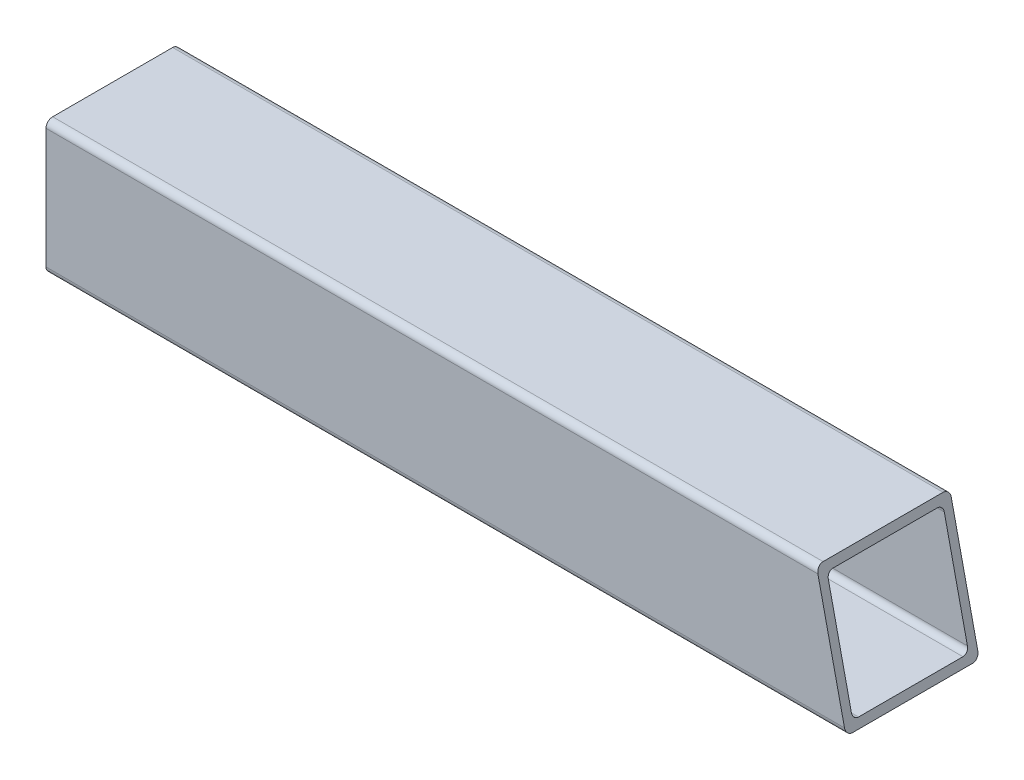
ISO-10303-21;
HEADER;
FILE_DESCRIPTION(('STEP AP214'),'2;1');
FILE_NAME('part.step','',(''),(''),'','','');
FILE_SCHEMA(('AUTOMOTIVE_DESIGN { 1 0 10303 214 1 1 1 1 }'));
ENDSEC;
DATA;
#1=APPLICATION_CONTEXT('core data for automotive mechanical design processes');
#2=APPLICATION_PROTOCOL_DEFINITION('international standard','automotive_design',2000,#1);
#3=PRODUCT_CONTEXT('',#1,'mechanical');
#4=PRODUCT('Part','Part','',(#3));
#5=PRODUCT_RELATED_PRODUCT_CATEGORY('part','',(#4));
#6=PRODUCT_DEFINITION_FORMATION('','',#4);
#7=PRODUCT_DEFINITION_CONTEXT('part definition',#1,'design');
#8=PRODUCT_DEFINITION('design','',#6,#7);
#9=PRODUCT_DEFINITION_SHAPE('','',#8);
#10=(LENGTH_UNIT() NAMED_UNIT(*) SI_UNIT(.MILLI.,.METRE.));
#11=(NAMED_UNIT(*) PLANE_ANGLE_UNIT() SI_UNIT($,.RADIAN.));
#12=(NAMED_UNIT(*) SI_UNIT($,.STERADIAN.) SOLID_ANGLE_UNIT());
#13=UNCERTAINTY_MEASURE_WITH_UNIT(LENGTH_MEASURE(1.E-05),#10,'distance_accuracy_value','');
#14=(GEOMETRIC_REPRESENTATION_CONTEXT(3) GLOBAL_UNCERTAINTY_ASSIGNED_CONTEXT((#13)) GLOBAL_UNIT_ASSIGNED_CONTEXT((#10,
#11,#12)) REPRESENTATION_CONTEXT('',''));
#15=CARTESIAN_POINT('',(0.,0.,0.));
#16=DIRECTION('',(0.,0.,1.));
#17=DIRECTION('',(1.,0.,0.));
#18=AXIS2_PLACEMENT_3D('',#15,#16,#17);
#19=CARTESIAN_POINT('',(76.2,-11.43,-11.43));
#20=DIRECTION('',(-1.,0.,0.));
#21=DIRECTION('',(0.,0.,1.));
#22=AXIS2_PLACEMENT_3D('',#19,#20,#21);
#23=CYLINDRICAL_SURFACE('',#22,1.27);
#24=DIRECTION('',(-1.,0.,0.));
#25=VECTOR('',#24,1.);
#26=CARTESIAN_POINT('',(76.2,-11.43,-12.7));
#27=LINE('',#26,#25);
#28=CARTESIAN_POINT('',(75.9184477784435,-11.43,-12.7));
#29=VERTEX_POINT('',#28);
#30=CARTESIAN_POINT('',(-76.2,-11.43,-12.7));
#31=VERTEX_POINT('',#30);
#32=EDGE_CURVE('E48',#29,#31,#27,.T.);
#33=ORIENTED_EDGE('',*,*,#32,.F.);
#34=CARTESIAN_POINT('',(75.9184477784435,-11.43,-11.43));
#35=DIRECTION('',(-0.976296007119935,-0.216439613938097,0.));
#36=DIRECTION('',(-0.216439613938097,0.976296007119935,0.));
#37=AXIS2_PLACEMENT_3D('',#34,#35,#36);
#38=ELLIPSE('',#37,1.30083498317943,1.27);
#39=CARTESIAN_POINT('',(76.2,-12.7,-11.43));
#40=VERTEX_POINT('',#39);
#41=EDGE_CURVE('E257',#29,#40,#38,.T.);
#42=ORIENTED_EDGE('',*,*,#41,.T.);
#43=DIRECTION('',(-1.,0.,0.));
#44=VECTOR('',#43,1.);
#45=CARTESIAN_POINT('',(76.2,-12.7,-11.43));
#46=LINE('',#45,#44);
#47=CARTESIAN_POINT('',(-76.2,-12.7,-11.43));
#48=VERTEX_POINT('',#47);
#49=EDGE_CURVE('E207',#40,#48,#46,.T.);
#50=ORIENTED_EDGE('',*,*,#49,.T.);
#51=CARTESIAN_POINT('',(-76.2,-11.43,-11.43));
#52=DIRECTION('',(1.,0.,0.));
#53=DIRECTION('',(0.,0.,-1.));
#54=AXIS2_PLACEMENT_3D('',#51,#52,#53);
#55=CIRCLE('',#54,1.27);
#56=EDGE_CURVE('E200',#48,#31,#55,.T.);
#57=ORIENTED_EDGE('',*,*,#56,.T.);
#58=EDGE_LOOP('',(#33,#42,#50,#57));
#59=FACE_BOUND('',#58,.T.);
#60=ADVANCED_FACE('F41',(#59),#23,.T.);
#61=CARTESIAN_POINT('',(76.2,-11.43,-12.7));
#62=DIRECTION('',(0.,0.,1.));
#63=DIRECTION('',(1.,0.,0.));
#64=AXIS2_PLACEMENT_3D('',#61,#62,#63);
#65=PLANE('',#64);
#66=DIRECTION('',(-1.,0.,0.));
#67=VECTOR('',#66,1.);
#68=CARTESIAN_POINT('',(76.2,11.43,-12.7));
#69=LINE('',#68,#67);
#70=CARTESIAN_POINT('',(70.850507790426,11.43,-12.7));
#71=VERTEX_POINT('',#70);
#72=CARTESIAN_POINT('',(-76.2,11.43,-12.7));
#73=VERTEX_POINT('',#72);
#74=EDGE_CURVE('E183',#71,#73,#69,.T.);
#75=ORIENTED_EDGE('',*,*,#74,.F.);
#76=DIRECTION('',(0.216439613938097,-0.976296007119935,0.));
#77=VECTOR('',#76,1.);
#78=CARTESIAN_POINT('',(76.2,-12.7,-12.7));
#79=LINE('',#78,#77);
#80=EDGE_CURVE('E168',#71,#29,#79,.T.);
#81=ORIENTED_EDGE('',*,*,#80,.T.);
#82=ORIENTED_EDGE('',*,*,#32,.T.);
#83=DIRECTION('',(0.,1.,0.));
#84=VECTOR('',#83,1.);
#85=CARTESIAN_POINT('',(-76.2,-11.43,-12.7));
#86=LINE('',#85,#84);
#87=EDGE_CURVE('E191',#31,#73,#86,.T.);
#88=ORIENTED_EDGE('',*,*,#87,.T.);
#89=EDGE_LOOP('',(#75,#81,#82,#88));
#90=FACE_BOUND('',#89,.T.);
#91=ADVANCED_FACE('F190',(#90),#65,.F.);
#92=CARTESIAN_POINT('',(76.2,11.43,-11.43));
#93=DIRECTION('',(-1.,0.,0.));
#94=DIRECTION('',(0.,0.,1.));
#95=AXIS2_PLACEMENT_3D('',#92,#93,#94);
#96=CYLINDRICAL_SURFACE('',#95,1.27);
#97=DIRECTION('',(-1.,0.,0.));
#98=VECTOR('',#97,1.);
#99=CARTESIAN_POINT('',(76.2,12.7,-11.43));
#100=LINE('',#99,#98);
#101=CARTESIAN_POINT('',(70.5689555688695,12.7,-11.43));
#102=VERTEX_POINT('',#101);
#103=CARTESIAN_POINT('',(-76.2,12.7,-11.43));
#104=VERTEX_POINT('',#103);
#105=EDGE_CURVE('E176',#102,#104,#100,.T.);
#106=ORIENTED_EDGE('',*,*,#105,.F.);
#107=CARTESIAN_POINT('',(70.850507790426,11.43,-11.43));
#108=DIRECTION('',(-0.976296007119935,-0.216439613938097,0.));
#109=DIRECTION('',(-0.216439613938097,0.976296007119935,0.));
#110=AXIS2_PLACEMENT_3D('',#107,#108,#109);
#111=ELLIPSE('',#110,1.30083498317942,1.27);
#112=EDGE_CURVE('E159',#102,#71,#111,.T.);
#113=ORIENTED_EDGE('',*,*,#112,.T.);
#114=ORIENTED_EDGE('',*,*,#74,.T.);
#115=CARTESIAN_POINT('',(-76.2,11.43,-11.43));
#116=DIRECTION('',(1.,0.,0.));
#117=DIRECTION('',(0.,0.,-1.));
#118=AXIS2_PLACEMENT_3D('',#115,#116,#117);
#119=CIRCLE('',#118,1.27);
#120=EDGE_CURVE('E204',#73,#104,#119,.T.);
#121=ORIENTED_EDGE('',*,*,#120,.T.);
#122=EDGE_LOOP('',(#106,#113,#114,#121));
#123=FACE_BOUND('',#122,.T.);
#124=ADVANCED_FACE('F256',(#123),#96,.T.);
#125=CARTESIAN_POINT('',(76.2,12.7,-11.43));
#126=DIRECTION('',(0.,-1.,0.));
#127=DIRECTION('',(0.,0.,-1.));
#128=AXIS2_PLACEMENT_3D('',#125,#126,#127);
#129=PLANE('',#128);
#130=DIRECTION('',(-1.,0.,0.));
#131=VECTOR('',#130,1.);
#132=CARTESIAN_POINT('',(76.2,12.7,11.43));
#133=LINE('',#132,#131);
#134=CARTESIAN_POINT('',(70.5689555688695,12.7,11.43));
#135=VERTEX_POINT('',#134);
#136=CARTESIAN_POINT('',(-76.2,12.7,11.43));
#137=VERTEX_POINT('',#136);
#138=EDGE_CURVE('E174',#135,#137,#133,.T.);
#139=ORIENTED_EDGE('',*,*,#138,.F.);
#140=DIRECTION('',(0.,0.,1.));
#141=VECTOR('',#140,1.);
#142=CARTESIAN_POINT('',(70.5689555688695,12.7,-12.7));
#143=LINE('',#142,#141);
#144=EDGE_CURVE('E155',#102,#135,#143,.T.);
#145=ORIENTED_EDGE('',*,*,#144,.F.);
#146=ORIENTED_EDGE('',*,*,#105,.T.);
#147=DIRECTION('',(0.,0.,1.));
#148=VECTOR('',#147,1.);
#149=CARTESIAN_POINT('',(-76.2,12.7,-11.43));
#150=LINE('',#149,#148);
#151=EDGE_CURVE('E216',#104,#137,#150,.T.);
#152=ORIENTED_EDGE('',*,*,#151,.T.);
#153=EDGE_LOOP('',(#139,#145,#146,#152));
#154=FACE_BOUND('',#153,.T.);
#155=ADVANCED_FACE('F252',(#154),#129,.F.);
#156=CARTESIAN_POINT('',(76.2,11.43,11.43));
#157=DIRECTION('',(-1.,0.,0.));
#158=DIRECTION('',(0.,0.,1.));
#159=AXIS2_PLACEMENT_3D('',#156,#157,#158);
#160=CYLINDRICAL_SURFACE('',#159,1.27);
#161=DIRECTION('',(-1.,0.,0.));
#162=VECTOR('',#161,1.);
#163=CARTESIAN_POINT('',(76.2,11.43,12.7));
#164=LINE('',#163,#162);
#165=CARTESIAN_POINT('',(70.850507790426,11.43,12.7));
#166=VERTEX_POINT('',#165);
#167=CARTESIAN_POINT('',(-76.2,11.43,12.7));
#168=VERTEX_POINT('',#167);
#169=EDGE_CURVE('E165',#166,#168,#164,.T.);
#170=ORIENTED_EDGE('',*,*,#169,.F.);
#171=CARTESIAN_POINT('',(70.850507790426,11.43,11.43));
#172=DIRECTION('',(-0.976296007119935,-0.216439613938097,0.));
#173=DIRECTION('',(-0.216439613938097,0.976296007119935,0.));
#174=AXIS2_PLACEMENT_3D('',#171,#172,#173);
#175=ELLIPSE('',#174,1.30083498317943,1.27);
#176=EDGE_CURVE('E150',#166,#135,#175,.T.);
#177=ORIENTED_EDGE('',*,*,#176,.T.);
#178=ORIENTED_EDGE('',*,*,#138,.T.);
#179=CARTESIAN_POINT('',(-76.2,11.43,11.43));
#180=DIRECTION('',(1.,0.,0.));
#181=DIRECTION('',(0.,0.,-1.));
#182=AXIS2_PLACEMENT_3D('',#179,#180,#181);
#183=CIRCLE('',#182,1.27);
#184=EDGE_CURVE('E173',#137,#168,#183,.T.);
#185=ORIENTED_EDGE('',*,*,#184,.T.);
#186=EDGE_LOOP('',(#170,#177,#178,#185));
#187=FACE_BOUND('',#186,.T.);
#188=ADVANCED_FACE('F171',(#187),#160,.T.);
#189=CARTESIAN_POINT('',(76.2,-11.43,12.7));
#190=DIRECTION('',(0.,0.,-1.));
#191=DIRECTION('',(-1.,0.,0.));
#192=AXIS2_PLACEMENT_3D('',#189,#190,#191);
#193=PLANE('',#192);
#194=DIRECTION('',(-1.,0.,0.));
#195=VECTOR('',#194,1.);
#196=CARTESIAN_POINT('',(76.2,-11.43,12.7));
#197=LINE('',#196,#195);
#198=CARTESIAN_POINT('',(75.9184477784435,-11.43,12.7));
#199=VERTEX_POINT('',#198);
#200=CARTESIAN_POINT('',(-76.2,-11.43,12.7));
#201=VERTEX_POINT('',#200);
#202=EDGE_CURVE('E167',#199,#201,#197,.T.);
#203=ORIENTED_EDGE('',*,*,#202,.F.);
#204=DIRECTION('',(0.216439613938097,-0.976296007119935,0.));
#205=VECTOR('',#204,1.);
#206=CARTESIAN_POINT('',(76.2,-12.7,12.7));
#207=LINE('',#206,#205);
#208=EDGE_CURVE('E153',#166,#199,#207,.T.);
#209=ORIENTED_EDGE('',*,*,#208,.F.);
#210=ORIENTED_EDGE('',*,*,#169,.T.);
#211=DIRECTION('',(0.,-1.,0.));
#212=VECTOR('',#211,1.);
#213=CARTESIAN_POINT('',(-76.2,-11.43,12.7));
#214=LINE('',#213,#212);
#215=EDGE_CURVE('E220',#168,#201,#214,.T.);
#216=ORIENTED_EDGE('',*,*,#215,.T.);
#217=EDGE_LOOP('',(#203,#209,#210,#216));
#218=FACE_BOUND('',#217,.T.);
#219=ADVANCED_FACE('F163',(#218),#193,.F.);
#220=CARTESIAN_POINT('',(76.2,-11.43,11.43));
#221=DIRECTION('',(-1.,0.,0.));
#222=DIRECTION('',(0.,0.,1.));
#223=AXIS2_PLACEMENT_3D('',#220,#221,#222);
#224=CYLINDRICAL_SURFACE('',#223,1.27);
#225=DIRECTION('',(-1.,0.,0.));
#226=VECTOR('',#225,1.);
#227=CARTESIAN_POINT('',(76.2,-12.7,11.43));
#228=LINE('',#227,#226);
#229=CARTESIAN_POINT('',(76.2,-12.7,11.43));
#230=VERTEX_POINT('',#229);
#231=CARTESIAN_POINT('',(-76.2,-12.7,11.43));
#232=VERTEX_POINT('',#231);
#233=EDGE_CURVE('E178',#230,#232,#228,.T.);
#234=ORIENTED_EDGE('',*,*,#233,.F.);
#235=CARTESIAN_POINT('',(75.9184477784435,-11.43,11.43));
#236=DIRECTION('',(-0.976296007119935,-0.216439613938097,0.));
#237=DIRECTION('',(-0.216439613938097,0.976296007119935,0.));
#238=AXIS2_PLACEMENT_3D('',#235,#236,#237);
#239=ELLIPSE('',#238,1.30083498317943,1.27);
#240=EDGE_CURVE('E62',#230,#199,#239,.T.);
#241=ORIENTED_EDGE('',*,*,#240,.T.);
#242=ORIENTED_EDGE('',*,*,#202,.T.);
#243=CARTESIAN_POINT('',(-76.2,-11.43,11.43));
#244=DIRECTION('',(1.,0.,0.));
#245=DIRECTION('',(0.,0.,-1.));
#246=AXIS2_PLACEMENT_3D('',#243,#244,#245);
#247=CIRCLE('',#246,1.27);
#248=EDGE_CURVE('E222',#201,#232,#247,.T.);
#249=ORIENTED_EDGE('',*,*,#248,.T.);
#250=EDGE_LOOP('',(#234,#241,#242,#249));
#251=FACE_BOUND('',#250,.T.);
#252=ADVANCED_FACE('F250',(#251),#224,.T.);
#253=CARTESIAN_POINT('',(76.2,-12.7,-11.43));
#254=DIRECTION('',(0.,1.,0.));
#255=DIRECTION('',(0.,0.,1.));
#256=AXIS2_PLACEMENT_3D('',#253,#254,#255);
#257=PLANE('',#256);
#258=ORIENTED_EDGE('',*,*,#233,.T.);
#259=DIRECTION('',(0.,0.,-1.));
#260=VECTOR('',#259,1.);
#261=CARTESIAN_POINT('',(-76.2,-12.7,-11.43));
#262=LINE('',#261,#260);
#263=EDGE_CURVE('E225',#232,#48,#262,.T.);
#264=ORIENTED_EDGE('',*,*,#263,.T.);
#265=ORIENTED_EDGE('',*,*,#49,.F.);
#266=DIRECTION('',(0.,0.,-1.));
#267=VECTOR('',#266,1.);
#268=CARTESIAN_POINT('',(76.2,-12.7,-11.43));
#269=LINE('',#268,#267);
#270=EDGE_CURVE('E243',#230,#40,#269,.T.);
#271=ORIENTED_EDGE('',*,*,#270,.F.);
#272=EDGE_LOOP('',(#258,#264,#265,#271));
#273=FACE_BOUND('',#272,.T.);
#274=ADVANCED_FACE('F247',(#273),#257,.F.);
#275=CARTESIAN_POINT('',(76.2,9.9441,-9.9441));
#276=DIRECTION('',(-1.,0.,0.));
#277=DIRECTION('',(0.,0.,1.));
#278=AXIS2_PLACEMENT_3D('',#275,#276,#277);
#279=CYLINDRICAL_SURFACE('',#278,1.1049);
#280=CARTESIAN_POINT('',(71.1799238896472,9.9441,-9.9441));
#281=DIRECTION('',(-0.976296007119935,-0.216439613938097,0.));
#282=DIRECTION('',(-0.216439613938097,0.976296007119935,0.));
#283=AXIS2_PLACEMENT_3D('',#280,#281,#282);
#284=ELLIPSE('',#283,1.1317264353661,1.1049);
#285=CARTESIAN_POINT('',(70.934973456893,11.049,-9.94409999999999));
#286=VERTEX_POINT('',#285);
#287=CARTESIAN_POINT('',(71.1799238896472,9.9441,-11.049));
#288=VERTEX_POINT('',#287);
#289=EDGE_CURVE('E54',#286,#288,#284,.T.);
#290=ORIENTED_EDGE('',*,*,#289,.F.);
#291=DIRECTION('',(-1.,0.,0.));
#292=VECTOR('',#291,1.);
#293=CARTESIAN_POINT('',(76.2,11.049,-9.94409999999999));
#294=LINE('',#293,#292);
#295=CARTESIAN_POINT('',(-76.2,11.049,-9.94409999999999));
#296=VERTEX_POINT('',#295);
#297=EDGE_CURVE('E241',#286,#296,#294,.T.);
#298=ORIENTED_EDGE('',*,*,#297,.T.);
#299=CARTESIAN_POINT('',(-76.2,9.9441,-9.9441));
#300=DIRECTION('',(1.,0.,0.));
#301=DIRECTION('',(0.,0.,-1.));
#302=AXIS2_PLACEMENT_3D('',#299,#300,#301);
#303=CIRCLE('',#302,1.1049);
#304=CARTESIAN_POINT('',(-76.2,9.9441,-11.049));
#305=VERTEX_POINT('',#304);
#306=EDGE_CURVE('E259',#305,#296,#303,.T.);
#307=ORIENTED_EDGE('',*,*,#306,.F.);
#308=DIRECTION('',(-1.,0.,0.));
#309=VECTOR('',#308,1.);
#310=CARTESIAN_POINT('',(76.2,9.9441,-11.049));
#311=LINE('',#310,#309);
#312=EDGE_CURVE('E227',#288,#305,#311,.T.);
#313=ORIENTED_EDGE('',*,*,#312,.F.);
#314=EDGE_LOOP('',(#290,#298,#307,#313));
#315=FACE_BOUND('',#314,.T.);
#316=ADVANCED_FACE('F295',(#315),#279,.F.);
#317=CARTESIAN_POINT('',(76.2,11.049,-9.94409999999999));
#318=DIRECTION('',(0.,-1.,0.));
#319=DIRECTION('',(0.,0.,-1.));
#320=AXIS2_PLACEMENT_3D('',#317,#318,#319);
#321=PLANE('',#320);
#322=DIRECTION('',(0.,0.,-1.));
#323=VECTOR('',#322,1.);
#324=CARTESIAN_POINT('',(70.934973456893,11.049,-9.94409999999999));
#325=LINE('',#324,#323);
#326=CARTESIAN_POINT('',(70.934973456893,11.049,9.94409999999999));
#327=VERTEX_POINT('',#326);
#328=EDGE_CURVE('E303',#327,#286,#325,.T.);
#329=ORIENTED_EDGE('',*,*,#328,.F.);
#330=DIRECTION('',(-1.,0.,0.));
#331=VECTOR('',#330,1.);
#332=CARTESIAN_POINT('',(76.2,11.049,9.94409999999999));
#333=LINE('',#332,#331);
#334=CARTESIAN_POINT('',(-76.2,11.049,9.94409999999999));
#335=VERTEX_POINT('',#334);
#336=EDGE_CURVE('E239',#327,#335,#333,.T.);
#337=ORIENTED_EDGE('',*,*,#336,.T.);
#338=DIRECTION('',(0.,0.,1.));
#339=VECTOR('',#338,1.);
#340=CARTESIAN_POINT('',(-76.2,11.049,-9.94409999999999));
#341=LINE('',#340,#339);
#342=EDGE_CURVE('E265',#296,#335,#341,.T.);
#343=ORIENTED_EDGE('',*,*,#342,.F.);
#344=ORIENTED_EDGE('',*,*,#297,.F.);
#345=EDGE_LOOP('',(#329,#337,#343,#344));
#346=FACE_BOUND('',#345,.T.);
#347=ADVANCED_FACE('F301',(#346),#321,.T.);
#348=CARTESIAN_POINT('',(76.2,9.94409999999999,9.94409999999999));
#349=DIRECTION('',(-1.,0.,0.));
#350=DIRECTION('',(0.,0.,1.));
#351=AXIS2_PLACEMENT_3D('',#348,#349,#350);
#352=CYLINDRICAL_SURFACE('',#351,1.10490000000001);
#353=CARTESIAN_POINT('',(71.1799238896472,9.94409999999999,9.94409999999999));
#354=DIRECTION('',(-0.976296007119935,-0.216439613938097,0.));
#355=DIRECTION('',(-0.216439613938097,0.976296007119935,0.));
#356=AXIS2_PLACEMENT_3D('',#353,#354,#355);
#357=ELLIPSE('',#356,1.13172643536611,1.10490000000001);
#358=CARTESIAN_POINT('',(71.1799238896472,9.94409999999999,11.049));
#359=VERTEX_POINT('',#358);
#360=EDGE_CURVE('E309',#359,#327,#357,.T.);
#361=ORIENTED_EDGE('',*,*,#360,.F.);
#362=DIRECTION('',(-1.,0.,0.));
#363=VECTOR('',#362,1.);
#364=CARTESIAN_POINT('',(76.2,9.94409999999999,11.049));
#365=LINE('',#364,#363);
#366=CARTESIAN_POINT('',(-76.2,9.94409999999999,11.049));
#367=VERTEX_POINT('',#366);
#368=EDGE_CURVE('E237',#359,#367,#365,.T.);
#369=ORIENTED_EDGE('',*,*,#368,.T.);
#370=CARTESIAN_POINT('',(-76.2,9.94409999999999,9.94409999999999));
#371=DIRECTION('',(1.,0.,0.));
#372=DIRECTION('',(0.,0.,-1.));
#373=AXIS2_PLACEMENT_3D('',#370,#371,#372);
#374=CIRCLE('',#373,1.10490000000001);
#375=EDGE_CURVE('E268',#335,#367,#374,.T.);
#376=ORIENTED_EDGE('',*,*,#375,.F.);
#377=ORIENTED_EDGE('',*,*,#336,.F.);
#378=EDGE_LOOP('',(#361,#369,#376,#377));
#379=FACE_BOUND('',#378,.T.);
#380=ADVANCED_FACE('F306',(#379),#352,.F.);
#381=CARTESIAN_POINT('',(76.2,9.94409999999999,11.049));
#382=DIRECTION('',(0.,0.,-1.));
#383=DIRECTION('',(0.,1.,0.));
#384=AXIS2_PLACEMENT_3D('',#381,#382,#383);
#385=PLANE('',#384);
#386=DIRECTION('',(-0.216439613938097,0.976296007119935,0.));
#387=VECTOR('',#386,1.);
#388=CARTESIAN_POINT('',(71.4150949096588,8.88331208021836,11.049));
#389=LINE('',#388,#387);
#390=CARTESIAN_POINT('',(75.5890316792223,-9.9441,11.049));
#391=VERTEX_POINT('',#390);
#392=EDGE_CURVE('E325',#391,#359,#389,.T.);
#393=ORIENTED_EDGE('',*,*,#392,.F.);
#394=DIRECTION('',(-1.,0.,0.));
#395=VECTOR('',#394,1.);
#396=CARTESIAN_POINT('',(76.2,-9.9441,11.049));
#397=LINE('',#396,#395);
#398=CARTESIAN_POINT('',(-76.2,-9.9441,11.049));
#399=VERTEX_POINT('',#398);
#400=EDGE_CURVE('E235',#391,#399,#397,.T.);
#401=ORIENTED_EDGE('',*,*,#400,.T.);
#402=DIRECTION('',(0.,-1.,0.));
#403=VECTOR('',#402,1.);
#404=CARTESIAN_POINT('',(-76.2,9.94409999999999,11.049));
#405=LINE('',#404,#403);
#406=EDGE_CURVE('E271',#367,#399,#405,.T.);
#407=ORIENTED_EDGE('',*,*,#406,.F.);
#408=ORIENTED_EDGE('',*,*,#368,.F.);
#409=EDGE_LOOP('',(#393,#401,#407,#408));
#410=FACE_BOUND('',#409,.T.);
#411=ADVANCED_FACE('F312',(#410),#385,.T.);
#412=CARTESIAN_POINT('',(76.2,-9.9441,9.9441));
#413=DIRECTION('',(-1.,0.,0.));
#414=DIRECTION('',(0.,0.,1.));
#415=AXIS2_PLACEMENT_3D('',#412,#413,#414);
#416=CYLINDRICAL_SURFACE('',#415,1.1049);
#417=CARTESIAN_POINT('',(75.5890316792223,-9.9441,9.9441));
#418=DIRECTION('',(-0.976296007119935,-0.216439613938097,0.));
#419=DIRECTION('',(-0.216439613938097,0.976296007119935,0.));
#420=AXIS2_PLACEMENT_3D('',#417,#418,#419);
#421=ELLIPSE('',#420,1.1317264353661,1.1049);
#422=CARTESIAN_POINT('',(75.8339821119765,-11.049,9.94409999999999));
#423=VERTEX_POINT('',#422);
#424=EDGE_CURVE('E319',#423,#391,#421,.T.);
#425=ORIENTED_EDGE('',*,*,#424,.F.);
#426=DIRECTION('',(-1.,0.,0.));
#427=VECTOR('',#426,1.);
#428=CARTESIAN_POINT('',(76.2,-11.049,9.94409999999999));
#429=LINE('',#428,#427);
#430=CARTESIAN_POINT('',(-76.2,-11.049,9.94409999999999));
#431=VERTEX_POINT('',#430);
#432=EDGE_CURVE('E233',#423,#431,#429,.T.);
#433=ORIENTED_EDGE('',*,*,#432,.T.);
#434=CARTESIAN_POINT('',(-76.2,-9.9441,9.9441));
#435=DIRECTION('',(1.,0.,0.));
#436=DIRECTION('',(0.,0.,-1.));
#437=AXIS2_PLACEMENT_3D('',#434,#435,#436);
#438=CIRCLE('',#437,1.1049);
#439=EDGE_CURVE('E274',#399,#431,#438,.T.);
#440=ORIENTED_EDGE('',*,*,#439,.F.);
#441=ORIENTED_EDGE('',*,*,#400,.F.);
#442=EDGE_LOOP('',(#425,#433,#440,#441));
#443=FACE_BOUND('',#442,.T.);
#444=ADVANCED_FACE('F317',(#443),#416,.F.);
#445=CARTESIAN_POINT('',(76.2,-11.049,-9.94409999999999));
#446=DIRECTION('',(0.,1.,0.));
#447=DIRECTION('',(0.,0.,1.));
#448=AXIS2_PLACEMENT_3D('',#445,#446,#447);
#449=PLANE('',#448);
#450=DIRECTION('',(0.,0.,1.));
#451=VECTOR('',#450,1.);
#452=CARTESIAN_POINT('',(75.8339821119765,-11.049,-9.94409999999999));
#453=LINE('',#452,#451);
#454=CARTESIAN_POINT('',(75.8339821119765,-11.049,-9.94409999999999));
#455=VERTEX_POINT('',#454);
#456=EDGE_CURVE('E323',#455,#423,#453,.T.);
#457=ORIENTED_EDGE('',*,*,#456,.F.);
#458=DIRECTION('',(-1.,0.,0.));
#459=VECTOR('',#458,1.);
#460=CARTESIAN_POINT('',(76.2,-11.049,-9.94409999999999));
#461=LINE('',#460,#459);
#462=CARTESIAN_POINT('',(-76.2,-11.049,-9.94409999999999));
#463=VERTEX_POINT('',#462);
#464=EDGE_CURVE('E231',#455,#463,#461,.T.);
#465=ORIENTED_EDGE('',*,*,#464,.T.);
#466=DIRECTION('',(0.,0.,-1.));
#467=VECTOR('',#466,1.);
#468=CARTESIAN_POINT('',(-76.2,-11.049,-9.94409999999999));
#469=LINE('',#468,#467);
#470=EDGE_CURVE('E277',#431,#463,#469,.T.);
#471=ORIENTED_EDGE('',*,*,#470,.F.);
#472=ORIENTED_EDGE('',*,*,#432,.F.);
#473=EDGE_LOOP('',(#457,#465,#471,#472));
#474=FACE_BOUND('',#473,.T.);
#475=ADVANCED_FACE('F322',(#474),#449,.T.);
#476=CARTESIAN_POINT('',(76.2,-9.9441,-9.9441));
#477=DIRECTION('',(-1.,0.,0.));
#478=DIRECTION('',(0.,0.,1.));
#479=AXIS2_PLACEMENT_3D('',#476,#477,#478);
#480=CYLINDRICAL_SURFACE('',#479,1.1049);
#481=CARTESIAN_POINT('',(75.5890316792223,-9.9441,-9.9441));
#482=DIRECTION('',(-0.976296007119935,-0.216439613938097,0.));
#483=DIRECTION('',(-0.216439613938097,0.976296007119935,0.));
#484=AXIS2_PLACEMENT_3D('',#481,#482,#483);
#485=ELLIPSE('',#484,1.1317264353661,1.1049);
#486=CARTESIAN_POINT('',(75.5890316792223,-9.9441,-11.049));
#487=VERTEX_POINT('',#486);
#488=EDGE_CURVE('E289',#487,#455,#485,.T.);
#489=ORIENTED_EDGE('',*,*,#488,.F.);
#490=DIRECTION('',(-1.,0.,0.));
#491=VECTOR('',#490,1.);
#492=CARTESIAN_POINT('',(76.2,-9.9441,-11.049));
#493=LINE('',#492,#491);
#494=CARTESIAN_POINT('',(-76.2,-9.9441,-11.049));
#495=VERTEX_POINT('',#494);
#496=EDGE_CURVE('E229',#487,#495,#493,.T.);
#497=ORIENTED_EDGE('',*,*,#496,.T.);
#498=CARTESIAN_POINT('',(-76.2,-9.9441,-9.9441));
#499=DIRECTION('',(1.,0.,0.));
#500=DIRECTION('',(0.,0.,-1.));
#501=AXIS2_PLACEMENT_3D('',#498,#499,#500);
#502=CIRCLE('',#501,1.1049);
#503=EDGE_CURVE('E211',#463,#495,#502,.T.);
#504=ORIENTED_EDGE('',*,*,#503,.F.);
#505=ORIENTED_EDGE('',*,*,#464,.F.);
#506=EDGE_LOOP('',(#489,#497,#504,#505));
#507=FACE_BOUND('',#506,.T.);
#508=ADVANCED_FACE('F287',(#507),#480,.F.);
#509=CARTESIAN_POINT('',(76.2,9.9441,-11.049));
#510=DIRECTION('',(0.,0.,1.));
#511=DIRECTION('',(1.,0.,0.));
#512=AXIS2_PLACEMENT_3D('',#509,#510,#511);
#513=PLANE('',#512);
#514=DIRECTION('',(0.216439613938097,-0.976296007119935,0.));
#515=VECTOR('',#514,1.);
#516=CARTESIAN_POINT('',(71.4150949096588,8.88331208021836,-11.049));
#517=LINE('',#516,#515);
#518=EDGE_CURVE('E11',#288,#487,#517,.T.);
#519=ORIENTED_EDGE('',*,*,#518,.F.);
#520=ORIENTED_EDGE('',*,*,#312,.T.);
#521=DIRECTION('',(0.,1.,0.));
#522=VECTOR('',#521,1.);
#523=CARTESIAN_POINT('',(-76.2,9.9441,-11.049));
#524=LINE('',#523,#522);
#525=EDGE_CURVE('E208',#495,#305,#524,.T.);
#526=ORIENTED_EDGE('',*,*,#525,.F.);
#527=ORIENTED_EDGE('',*,*,#496,.F.);
#528=EDGE_LOOP('',(#519,#520,#526,#527));
#529=FACE_BOUND('',#528,.T.);
#530=ADVANCED_FACE('F291',(#529),#513,.T.);
#531=CARTESIAN_POINT('',(-76.2,-11.43,-11.43));
#532=DIRECTION('',(1.,0.,0.));
#533=DIRECTION('',(0.,0.,-1.));
#534=AXIS2_PLACEMENT_3D('',#531,#532,#533);
#535=PLANE('',#534);
#536=ORIENTED_EDGE('',*,*,#525,.T.);
#537=ORIENTED_EDGE('',*,*,#306,.T.);
#538=ORIENTED_EDGE('',*,*,#342,.T.);
#539=ORIENTED_EDGE('',*,*,#375,.T.);
#540=ORIENTED_EDGE('',*,*,#406,.T.);
#541=ORIENTED_EDGE('',*,*,#439,.T.);
#542=ORIENTED_EDGE('',*,*,#470,.T.);
#543=ORIENTED_EDGE('',*,*,#503,.T.);
#544=EDGE_LOOP('',(#536,#537,#538,#539,#540,#541,#542,#543));
#545=FACE_BOUND('',#544,.T.);
#546=ORIENTED_EDGE('',*,*,#56,.F.);
#547=ORIENTED_EDGE('',*,*,#263,.F.);
#548=ORIENTED_EDGE('',*,*,#248,.F.);
#549=ORIENTED_EDGE('',*,*,#215,.F.);
#550=ORIENTED_EDGE('',*,*,#184,.F.);
#551=ORIENTED_EDGE('',*,*,#151,.F.);
#552=ORIENTED_EDGE('',*,*,#120,.F.);
#553=ORIENTED_EDGE('',*,*,#87,.F.);
#554=EDGE_LOOP('',(#546,#547,#548,#549,#550,#551,#552,#553));
#555=FACE_BOUND('',#554,.T.);
#556=ADVANCED_FACE('F198',(#545,#555),#535,.F.);
#557=CARTESIAN_POINT('',(76.2,-12.7,-12.7));
#558=DIRECTION('',(-0.976296007119935,-0.216439613938097,0.));
#559=DIRECTION('',(0.216439613938097,-0.976296007119935,0.));
#560=AXIS2_PLACEMENT_3D('',#557,#558,#559);
#561=PLANE('',#560);
#562=ORIENTED_EDGE('',*,*,#289,.T.);
#563=ORIENTED_EDGE('',*,*,#518,.T.);
#564=ORIENTED_EDGE('',*,*,#488,.T.);
#565=ORIENTED_EDGE('',*,*,#456,.T.);
#566=ORIENTED_EDGE('',*,*,#424,.T.);
#567=ORIENTED_EDGE('',*,*,#392,.T.);
#568=ORIENTED_EDGE('',*,*,#360,.T.);
#569=ORIENTED_EDGE('',*,*,#328,.T.);
#570=EDGE_LOOP('',(#562,#563,#564,#565,#566,#567,#568,#569));
#571=FACE_BOUND('',#570,.T.);
#572=ORIENTED_EDGE('',*,*,#80,.F.);
#573=ORIENTED_EDGE('',*,*,#112,.F.);
#574=ORIENTED_EDGE('',*,*,#144,.T.);
#575=ORIENTED_EDGE('',*,*,#176,.F.);
#576=ORIENTED_EDGE('',*,*,#208,.T.);
#577=ORIENTED_EDGE('',*,*,#240,.F.);
#578=ORIENTED_EDGE('',*,*,#270,.T.);
#579=ORIENTED_EDGE('',*,*,#41,.F.);
#580=EDGE_LOOP('',(#572,#573,#574,#575,#576,#577,#578,#579));
#581=FACE_BOUND('',#580,.T.);
#582=ADVANCED_FACE('F152',(#571,#581),#561,.F.);
#583=CLOSED_SHELL('',(#60,#91,#124,#155,#188,#219,#252,#274,#316,#347,#380,#411,#444,#475,#508,
#530,#556,#582));
#584=MANIFOLD_SOLID_BREP('B2',#583);
#585=ADVANCED_BREP_SHAPE_REPRESENTATION('',(#18,#584),#14);
#586=SHAPE_DEFINITION_REPRESENTATION(#9,#585);
ENDSEC;
END-ISO-10303-21;
